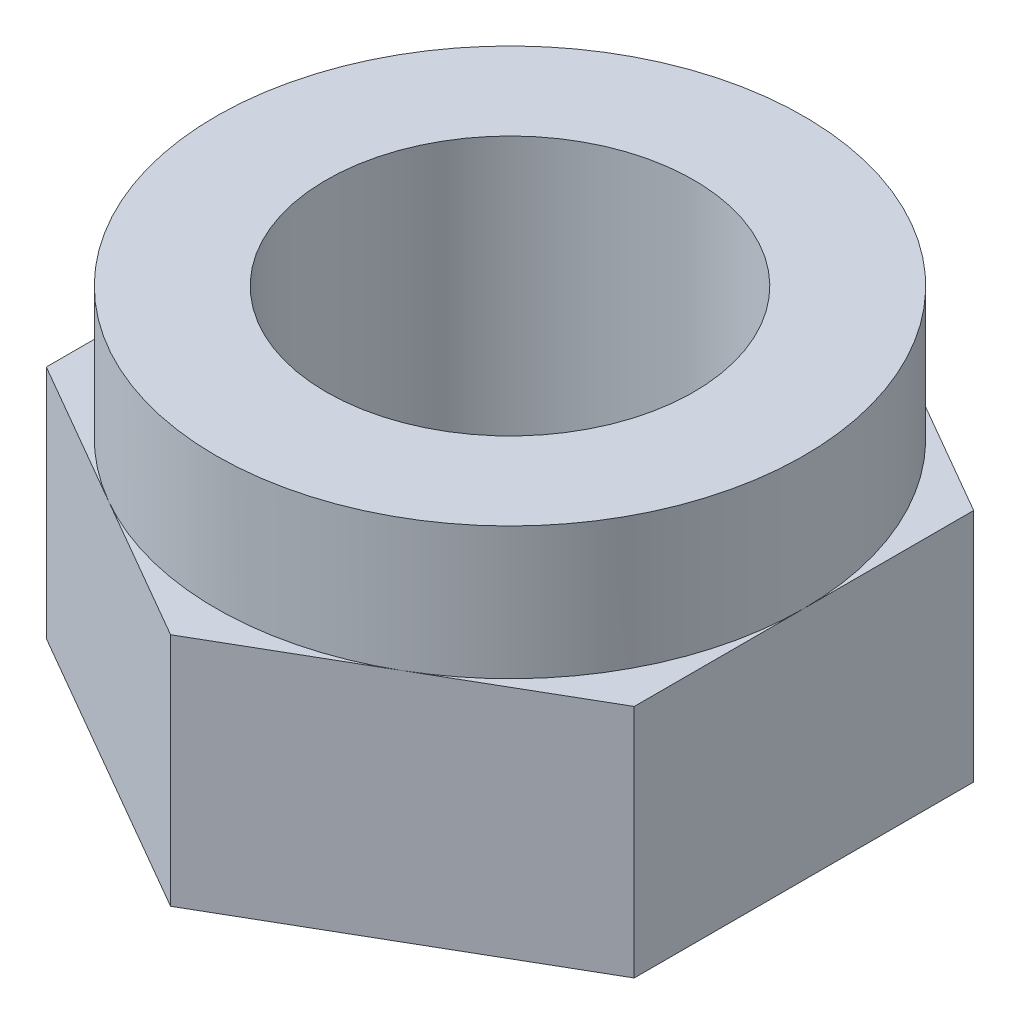
ISO-10303-21;
HEADER;
FILE_DESCRIPTION(('STEP AP214'),'2;1');
FILE_NAME('part.step','',(''),(''),'','','');
FILE_SCHEMA(('AUTOMOTIVE_DESIGN { 1 0 10303 214 1 1 1 1 }'));
ENDSEC;
DATA;
#1=APPLICATION_CONTEXT('core data for automotive mechanical design processes');
#2=APPLICATION_PROTOCOL_DEFINITION('international standard','automotive_design',2000,#1);
#3=PRODUCT_CONTEXT('',#1,'mechanical');
#4=PRODUCT('Part','Part','',(#3));
#5=PRODUCT_RELATED_PRODUCT_CATEGORY('part','',(#4));
#6=PRODUCT_DEFINITION_FORMATION('','',#4);
#7=PRODUCT_DEFINITION_CONTEXT('part definition',#1,'design');
#8=PRODUCT_DEFINITION('design','',#6,#7);
#9=PRODUCT_DEFINITION_SHAPE('','',#8);
#10=(LENGTH_UNIT() NAMED_UNIT(*) SI_UNIT(.MILLI.,.METRE.));
#11=(NAMED_UNIT(*) PLANE_ANGLE_UNIT() SI_UNIT($,.RADIAN.));
#12=(NAMED_UNIT(*) SI_UNIT($,.STERADIAN.) SOLID_ANGLE_UNIT());
#13=UNCERTAINTY_MEASURE_WITH_UNIT(LENGTH_MEASURE(1.E-05),#10,'distance_accuracy_value','');
#14=(GEOMETRIC_REPRESENTATION_CONTEXT(3) GLOBAL_UNCERTAINTY_ASSIGNED_CONTEXT((#13)) GLOBAL_UNIT_ASSIGNED_CONTEXT((#10,
#11,#12)) REPRESENTATION_CONTEXT('',''));
#15=CARTESIAN_POINT('',(0.,0.,0.));
#16=DIRECTION('',(0.,0.,1.));
#17=DIRECTION('',(1.,0.,0.));
#18=AXIS2_PLACEMENT_3D('',#15,#16,#17);
#19=CARTESIAN_POINT('',(0.,3.2,0.));
#20=DIRECTION('',(0.,1.,0.));
#21=DIRECTION('',(0.,0.,1.));
#22=AXIS2_PLACEMENT_3D('',#19,#20,#21);
#23=PLANE('',#22);
#24=CARTESIAN_POINT('',(0.,3.2,0.));
#25=DIRECTION('',(0.,1.,0.));
#26=DIRECTION('',(0.,0.,1.));
#27=AXIS2_PLACEMENT_3D('',#24,#25,#26);
#28=CIRCLE('',#27,4.);
#29=CARTESIAN_POINT('',(2.,3.2,3.46410161513775));
#30=VERTEX_POINT('',#29);
#31=CARTESIAN_POINT('',(4.,3.2,0.));
#32=VERTEX_POINT('',#31);
#33=EDGE_CURVE('E46',#30,#32,#28,.T.);
#34=ORIENTED_EDGE('',*,*,#33,.F.);
#35=DIRECTION('',(0.866025403784439,0.,-0.5));
#36=VECTOR('',#35,1.);
#37=CARTESIAN_POINT('',(0.,3.2,4.61880215351701));
#38=LINE('',#37,#36);
#39=CARTESIAN_POINT('',(4.,3.2,2.3094010767585));
#40=VERTEX_POINT('',#39);
#41=EDGE_CURVE('E121',#30,#40,#38,.T.);
#42=ORIENTED_EDGE('',*,*,#41,.T.);
#43=DIRECTION('',(0.,0.,-1.));
#44=VECTOR('',#43,1.);
#45=CARTESIAN_POINT('',(4.,3.2,2.3094010767585));
#46=LINE('',#45,#44);
#47=EDGE_CURVE('E133',#40,#32,#46,.T.);
#48=ORIENTED_EDGE('',*,*,#47,.T.);
#49=EDGE_LOOP('',(#34,#42,#48));
#50=FACE_BOUND('',#49,.T.);
#51=ADVANCED_FACE('F35',(#50),#23,.T.);
#52=CARTESIAN_POINT('',(2.,3.2,-3.46410161513776));
#53=VERTEX_POINT('',#52);
#54=EDGE_CURVE('E11',#32,#53,#28,.T.);
#55=ORIENTED_EDGE('',*,*,#54,.F.);
#56=CARTESIAN_POINT('',(4.,3.2,-2.3094010767585));
#57=VERTEX_POINT('',#56);
#58=EDGE_CURVE('E120',#32,#57,#46,.T.);
#59=ORIENTED_EDGE('',*,*,#58,.T.);
#60=DIRECTION('',(-0.866025403784439,0.,-0.5));
#61=VECTOR('',#60,1.);
#62=CARTESIAN_POINT('',(4.,3.2,-2.3094010767585));
#63=LINE('',#62,#61);
#64=EDGE_CURVE('E148',#57,#53,#63,.T.);
#65=ORIENTED_EDGE('',*,*,#64,.T.);
#66=EDGE_LOOP('',(#55,#59,#65));
#67=FACE_BOUND('',#66,.T.);
#68=ADVANCED_FACE('F206',(#67),#23,.T.);
#69=CARTESIAN_POINT('',(-2.,3.2,-3.46410161513776));
#70=VERTEX_POINT('',#69);
#71=EDGE_CURVE('E44',#53,#70,#28,.T.);
#72=ORIENTED_EDGE('',*,*,#71,.F.);
#73=CARTESIAN_POINT('',(0.,3.2,-4.61880215351701));
#74=VERTEX_POINT('',#73);
#75=EDGE_CURVE('E147',#53,#74,#63,.T.);
#76=ORIENTED_EDGE('',*,*,#75,.T.);
#77=DIRECTION('',(-0.866025403784439,0.,0.5));
#78=VECTOR('',#77,1.);
#79=CARTESIAN_POINT('',(0.,3.2,-4.61880215351701));
#80=LINE('',#79,#78);
#81=EDGE_CURVE('E152',#74,#70,#80,.T.);
#82=ORIENTED_EDGE('',*,*,#81,.T.);
#83=EDGE_LOOP('',(#72,#76,#82));
#84=FACE_BOUND('',#83,.T.);
#85=ADVANCED_FACE('F204',(#84),#23,.T.);
#86=CARTESIAN_POINT('',(-4.,3.2,0.));
#87=VERTEX_POINT('',#86);
#88=EDGE_CURVE('E61',#70,#87,#28,.T.);
#89=ORIENTED_EDGE('',*,*,#88,.F.);
#90=CARTESIAN_POINT('',(-4.,3.2,-2.3094010767585));
#91=VERTEX_POINT('',#90);
#92=EDGE_CURVE('E151',#70,#91,#80,.T.);
#93=ORIENTED_EDGE('',*,*,#92,.T.);
#94=DIRECTION('',(0.,0.,1.));
#95=VECTOR('',#94,1.);
#96=CARTESIAN_POINT('',(-4.,3.2,-2.3094010767585));
#97=LINE('',#96,#95);
#98=EDGE_CURVE('E156',#91,#87,#97,.T.);
#99=ORIENTED_EDGE('',*,*,#98,.T.);
#100=EDGE_LOOP('',(#89,#93,#99));
#101=FACE_BOUND('',#100,.T.);
#102=ADVANCED_FACE('F213',(#101),#23,.T.);
#103=CARTESIAN_POINT('',(-2.,3.2,3.46410161513775));
#104=VERTEX_POINT('',#103);
#105=EDGE_CURVE('E53',#87,#104,#28,.T.);
#106=ORIENTED_EDGE('',*,*,#105,.F.);
#107=CARTESIAN_POINT('',(-4.,3.2,2.3094010767585));
#108=VERTEX_POINT('',#107);
#109=EDGE_CURVE('E155',#87,#108,#97,.T.);
#110=ORIENTED_EDGE('',*,*,#109,.T.);
#111=DIRECTION('',(0.866025403784439,0.,0.5));
#112=VECTOR('',#111,1.);
#113=CARTESIAN_POINT('',(-4.,3.2,2.3094010767585));
#114=LINE('',#113,#112);
#115=EDGE_CURVE('E131',#108,#104,#114,.T.);
#116=ORIENTED_EDGE('',*,*,#115,.T.);
#117=EDGE_LOOP('',(#106,#110,#116));
#118=FACE_BOUND('',#117,.T.);
#119=ADVANCED_FACE('F217',(#118),#23,.T.);
#120=EDGE_CURVE('E114',#104,#30,#28,.T.);
#121=ORIENTED_EDGE('',*,*,#120,.F.);
#122=CARTESIAN_POINT('',(0.,3.2,4.61880215351701));
#123=VERTEX_POINT('',#122);
#124=EDGE_CURVE('E116',#104,#123,#114,.T.);
#125=ORIENTED_EDGE('',*,*,#124,.T.);
#126=EDGE_CURVE('E110',#123,#30,#38,.T.);
#127=ORIENTED_EDGE('',*,*,#126,.T.);
#128=EDGE_LOOP('',(#121,#125,#127));
#129=FACE_BOUND('',#128,.T.);
#130=ADVANCED_FACE('F112',(#129),#23,.T.);
#131=CARTESIAN_POINT('',(0.,0.,0.));
#132=DIRECTION('',(0.,1.,0.));
#133=DIRECTION('',(0.,0.,1.));
#134=AXIS2_PLACEMENT_3D('',#131,#132,#133);
#135=PLANE('',#134);
#136=DIRECTION('',(0.866025403784439,0.,0.5));
#137=VECTOR('',#136,1.);
#138=CARTESIAN_POINT('',(-4.,0.,2.3094010767585));
#139=LINE('',#138,#137);
#140=CARTESIAN_POINT('',(-4.,0.,2.3094010767585));
#141=VERTEX_POINT('',#140);
#142=CARTESIAN_POINT('',(0.,0.,4.61880215351701));
#143=VERTEX_POINT('',#142);
#144=EDGE_CURVE('E144',#141,#143,#139,.T.);
#145=ORIENTED_EDGE('',*,*,#144,.F.);
#146=DIRECTION('',(0.,0.,1.));
#147=VECTOR('',#146,1.);
#148=CARTESIAN_POINT('',(-4.,0.,-2.3094010767585));
#149=LINE('',#148,#147);
#150=CARTESIAN_POINT('',(-4.,0.,-2.3094010767585));
#151=VERTEX_POINT('',#150);
#152=EDGE_CURVE('E169',#151,#141,#149,.T.);
#153=ORIENTED_EDGE('',*,*,#152,.F.);
#154=DIRECTION('',(-0.866025403784439,0.,0.5));
#155=VECTOR('',#154,1.);
#156=CARTESIAN_POINT('',(0.,0.,-4.61880215351701));
#157=LINE('',#156,#155);
#158=CARTESIAN_POINT('',(0.,0.,-4.61880215351701));
#159=VERTEX_POINT('',#158);
#160=EDGE_CURVE('E167',#159,#151,#157,.T.);
#161=ORIENTED_EDGE('',*,*,#160,.F.);
#162=DIRECTION('',(-0.866025403784439,0.,-0.5));
#163=VECTOR('',#162,1.);
#164=CARTESIAN_POINT('',(4.,0.,-2.3094010767585));
#165=LINE('',#164,#163);
#166=CARTESIAN_POINT('',(4.,0.,-2.3094010767585));
#167=VERTEX_POINT('',#166);
#168=EDGE_CURVE('E165',#167,#159,#165,.T.);
#169=ORIENTED_EDGE('',*,*,#168,.F.);
#170=DIRECTION('',(0.,0.,-1.));
#171=VECTOR('',#170,1.);
#172=CARTESIAN_POINT('',(4.,0.,2.3094010767585));
#173=LINE('',#172,#171);
#174=CARTESIAN_POINT('',(4.,0.,2.3094010767585));
#175=VERTEX_POINT('',#174);
#176=EDGE_CURVE('E163',#175,#167,#173,.T.);
#177=ORIENTED_EDGE('',*,*,#176,.F.);
#178=DIRECTION('',(0.866025403784439,0.,-0.5));
#179=VECTOR('',#178,1.);
#180=CARTESIAN_POINT('',(0.,0.,4.61880215351701));
#181=LINE('',#180,#179);
#182=EDGE_CURVE('E161',#143,#175,#181,.T.);
#183=ORIENTED_EDGE('',*,*,#182,.F.);
#184=EDGE_LOOP('',(#145,#153,#161,#169,#177,#183));
#185=FACE_BOUND('',#184,.T.);
#186=CARTESIAN_POINT('',(0.,0.,0.));
#187=DIRECTION('',(0.,1.,0.));
#188=DIRECTION('',(0.,0.,1.));
#189=AXIS2_PLACEMENT_3D('',#186,#187,#188);
#190=CIRCLE('',#189,2.5);
#191=CARTESIAN_POINT('',(0.,0.,2.5));
#192=VERTEX_POINT('',#191);
#193=EDGE_CURVE('E141',#192,#192,#190,.T.);
#194=ORIENTED_EDGE('',*,*,#193,.T.);
#195=EDGE_LOOP('',(#194));
#196=FACE_BOUND('',#195,.T.);
#197=ADVANCED_FACE('F189',(#185,#196),#135,.F.);
#198=CARTESIAN_POINT('',(-4.,3.2,2.3094010767585));
#199=DIRECTION('',(0.5,0.,-0.866025403784439));
#200=DIRECTION('',(-0.866025403784439,0.,-0.5));
#201=AXIS2_PLACEMENT_3D('',#198,#199,#200);
#202=PLANE('',#201);
#203=ORIENTED_EDGE('',*,*,#144,.T.);
#204=DIRECTION('',(0.,-1.,0.));
#205=VECTOR('',#204,1.);
#206=CARTESIAN_POINT('',(0.,3.2,4.61880215351701));
#207=LINE('',#206,#205);
#208=EDGE_CURVE('E39',#123,#143,#207,.T.);
#209=ORIENTED_EDGE('',*,*,#208,.F.);
#210=ORIENTED_EDGE('',*,*,#124,.F.);
#211=ORIENTED_EDGE('',*,*,#115,.F.);
#212=DIRECTION('',(0.,-1.,0.));
#213=VECTOR('',#212,1.);
#214=CARTESIAN_POINT('',(-4.,3.2,2.3094010767585));
#215=LINE('',#214,#213);
#216=EDGE_CURVE('E158',#108,#141,#215,.T.);
#217=ORIENTED_EDGE('',*,*,#216,.T.);
#218=EDGE_LOOP('',(#203,#209,#210,#211,#217));
#219=FACE_BOUND('',#218,.T.);
#220=ADVANCED_FACE('F37',(#219),#202,.F.);
#221=CARTESIAN_POINT('',(0.,3.2,4.61880215351701));
#222=DIRECTION('',(-0.5,0.,-0.866025403784439));
#223=DIRECTION('',(-0.866025403784439,0.,0.5));
#224=AXIS2_PLACEMENT_3D('',#221,#222,#223);
#225=PLANE('',#224);
#226=ORIENTED_EDGE('',*,*,#182,.T.);
#227=DIRECTION('',(0.,-1.,0.));
#228=VECTOR('',#227,1.);
#229=CARTESIAN_POINT('',(4.,3.2,2.3094010767585));
#230=LINE('',#229,#228);
#231=EDGE_CURVE('E127',#40,#175,#230,.T.);
#232=ORIENTED_EDGE('',*,*,#231,.F.);
#233=ORIENTED_EDGE('',*,*,#41,.F.);
#234=ORIENTED_EDGE('',*,*,#126,.F.);
#235=ORIENTED_EDGE('',*,*,#208,.T.);
#236=EDGE_LOOP('',(#226,#232,#233,#234,#235));
#237=FACE_BOUND('',#236,.T.);
#238=ADVANCED_FACE('F125',(#237),#225,.F.);
#239=CARTESIAN_POINT('',(4.,3.2,2.3094010767585));
#240=DIRECTION('',(-1.,0.,0.));
#241=DIRECTION('',(0.,0.,1.));
#242=AXIS2_PLACEMENT_3D('',#239,#240,#241);
#243=PLANE('',#242);
#244=ORIENTED_EDGE('',*,*,#176,.T.);
#245=DIRECTION('',(0.,-1.,0.));
#246=VECTOR('',#245,1.);
#247=CARTESIAN_POINT('',(4.,3.2,-2.3094010767585));
#248=LINE('',#247,#246);
#249=EDGE_CURVE('E179',#57,#167,#248,.T.);
#250=ORIENTED_EDGE('',*,*,#249,.F.);
#251=ORIENTED_EDGE('',*,*,#58,.F.);
#252=ORIENTED_EDGE('',*,*,#47,.F.);
#253=ORIENTED_EDGE('',*,*,#231,.T.);
#254=EDGE_LOOP('',(#244,#250,#251,#252,#253));
#255=FACE_BOUND('',#254,.T.);
#256=ADVANCED_FACE('F183',(#255),#243,.F.);
#257=CARTESIAN_POINT('',(4.,3.2,-2.3094010767585));
#258=DIRECTION('',(-0.5,0.,0.866025403784439));
#259=DIRECTION('',(0.866025403784439,0.,0.5));
#260=AXIS2_PLACEMENT_3D('',#257,#258,#259);
#261=PLANE('',#260);
#262=ORIENTED_EDGE('',*,*,#168,.T.);
#263=DIRECTION('',(0.,-1.,0.));
#264=VECTOR('',#263,1.);
#265=CARTESIAN_POINT('',(0.,3.2,-4.61880215351701));
#266=LINE('',#265,#264);
#267=EDGE_CURVE('E176',#74,#159,#266,.T.);
#268=ORIENTED_EDGE('',*,*,#267,.F.);
#269=ORIENTED_EDGE('',*,*,#75,.F.);
#270=ORIENTED_EDGE('',*,*,#64,.F.);
#271=ORIENTED_EDGE('',*,*,#249,.T.);
#272=EDGE_LOOP('',(#262,#268,#269,#270,#271));
#273=FACE_BOUND('',#272,.T.);
#274=ADVANCED_FACE('F195',(#273),#261,.F.);
#275=CARTESIAN_POINT('',(0.,3.2,-4.61880215351701));
#276=DIRECTION('',(0.5,0.,0.866025403784439));
#277=DIRECTION('',(0.866025403784439,0.,-0.5));
#278=AXIS2_PLACEMENT_3D('',#275,#276,#277);
#279=PLANE('',#278);
#280=ORIENTED_EDGE('',*,*,#160,.T.);
#281=DIRECTION('',(0.,-1.,0.));
#282=VECTOR('',#281,1.);
#283=CARTESIAN_POINT('',(-4.,3.2,-2.3094010767585));
#284=LINE('',#283,#282);
#285=EDGE_CURVE('E173',#91,#151,#284,.T.);
#286=ORIENTED_EDGE('',*,*,#285,.F.);
#287=ORIENTED_EDGE('',*,*,#92,.F.);
#288=ORIENTED_EDGE('',*,*,#81,.F.);
#289=ORIENTED_EDGE('',*,*,#267,.T.);
#290=EDGE_LOOP('',(#280,#286,#287,#288,#289));
#291=FACE_BOUND('',#290,.T.);
#292=ADVANCED_FACE('F200',(#291),#279,.F.);
#293=CARTESIAN_POINT('',(-4.,3.2,-2.3094010767585));
#294=DIRECTION('',(1.,0.,0.));
#295=DIRECTION('',(0.,0.,-1.));
#296=AXIS2_PLACEMENT_3D('',#293,#294,#295);
#297=PLANE('',#296);
#298=ORIENTED_EDGE('',*,*,#152,.T.);
#299=ORIENTED_EDGE('',*,*,#216,.F.);
#300=ORIENTED_EDGE('',*,*,#109,.F.);
#301=ORIENTED_EDGE('',*,*,#98,.F.);
#302=ORIENTED_EDGE('',*,*,#285,.T.);
#303=EDGE_LOOP('',(#298,#299,#300,#301,#302));
#304=FACE_BOUND('',#303,.T.);
#305=ADVANCED_FACE('F222',(#304),#297,.F.);
#306=CARTESIAN_POINT('',(0.,3.2,0.));
#307=DIRECTION('',(0.,-1.,0.));
#308=DIRECTION('',(0.,0.,-1.));
#309=AXIS2_PLACEMENT_3D('',#306,#307,#308);
#310=CYLINDRICAL_SURFACE('',#309,2.5);
#311=ORIENTED_EDGE('',*,*,#193,.F.);
#312=EDGE_LOOP('',(#311));
#313=FACE_BOUND('',#312,.T.);
#314=CARTESIAN_POINT('',(0.,5.,0.));
#315=DIRECTION('',(0.,1.,0.));
#316=DIRECTION('',(0.,0.,1.));
#317=AXIS2_PLACEMENT_3D('',#314,#315,#316);
#318=CIRCLE('',#317,2.5);
#319=CARTESIAN_POINT('',(0.,5.,2.5));
#320=VERTEX_POINT('',#319);
#321=EDGE_CURVE('E136',#320,#320,#318,.T.);
#322=ORIENTED_EDGE('',*,*,#321,.T.);
#323=EDGE_LOOP('',(#322));
#324=FACE_BOUND('',#323,.T.);
#325=ADVANCED_FACE('F218',(#313,#324),#310,.F.);
#326=CARTESIAN_POINT('',(0.,5.,0.));
#327=DIRECTION('',(0.,1.,0.));
#328=DIRECTION('',(0.,0.,1.));
#329=AXIS2_PLACEMENT_3D('',#326,#327,#328);
#330=PLANE('',#329);
#331=CARTESIAN_POINT('',(0.,5.,0.));
#332=DIRECTION('',(0.,1.,0.));
#333=DIRECTION('',(0.,0.,1.));
#334=AXIS2_PLACEMENT_3D('',#331,#332,#333);
#335=CIRCLE('',#334,4.);
#336=CARTESIAN_POINT('',(0.,5.,4.));
#337=VERTEX_POINT('',#336);
#338=EDGE_CURVE('E135',#337,#337,#335,.T.);
#339=ORIENTED_EDGE('',*,*,#338,.T.);
#340=EDGE_LOOP('',(#339));
#341=FACE_BOUND('',#340,.T.);
#342=ORIENTED_EDGE('',*,*,#321,.F.);
#343=EDGE_LOOP('',(#342));
#344=FACE_BOUND('',#343,.T.);
#345=ADVANCED_FACE('F288',(#341,#344),#330,.T.);
#346=CARTESIAN_POINT('',(0.,5.,0.));
#347=DIRECTION('',(0.,-1.,0.));
#348=DIRECTION('',(0.,0.,-1.));
#349=AXIS2_PLACEMENT_3D('',#346,#347,#348);
#350=CYLINDRICAL_SURFACE('',#349,4.);
#351=ORIENTED_EDGE('',*,*,#338,.F.);
#352=EDGE_LOOP('',(#351));
#353=FACE_BOUND('',#352,.T.);
#354=ORIENTED_EDGE('',*,*,#33,.T.);
#355=ORIENTED_EDGE('',*,*,#54,.T.);
#356=ORIENTED_EDGE('',*,*,#71,.T.);
#357=ORIENTED_EDGE('',*,*,#88,.T.);
#358=ORIENTED_EDGE('',*,*,#105,.T.);
#359=ORIENTED_EDGE('',*,*,#120,.T.);
#360=EDGE_LOOP('',(#354,#355,#356,#357,#358,#359));
#361=FACE_BOUND('',#360,.T.);
#362=ADVANCED_FACE('F137',(#353,#361),#350,.T.);
#363=CLOSED_SHELL('',(#51,#68,#85,#102,#119,#130,#197,#220,#238,#256,#274,#292,#305,#325,#345,#362));
#364=MANIFOLD_SOLID_BREP('B2',#363);
#365=ADVANCED_BREP_SHAPE_REPRESENTATION('',(#18,#364),#14);
#366=SHAPE_DEFINITION_REPRESENTATION(#9,#365);
ENDSEC;
END-ISO-10303-21;
